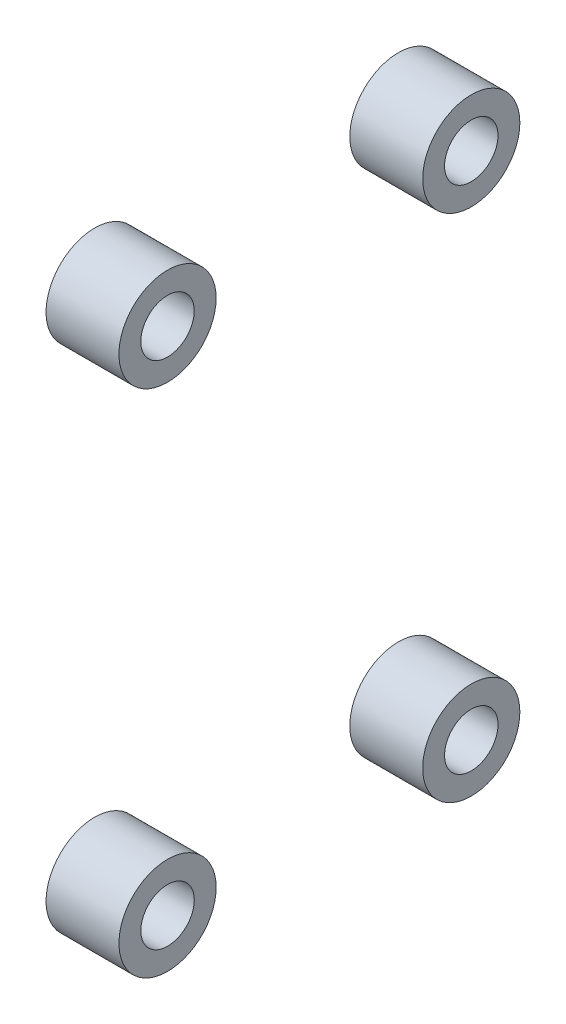
ISO-10303-21;
HEADER;
FILE_DESCRIPTION(('STEP AP214'),'2;1');
FILE_NAME('part.step','',(''),(''),'','','');
FILE_SCHEMA(('AUTOMOTIVE_DESIGN { 1 0 10303 214 1 1 1 1 }'));
ENDSEC;
DATA;
#1=APPLICATION_CONTEXT('core data for automotive mechanical design processes');
#2=APPLICATION_PROTOCOL_DEFINITION('international standard','automotive_design',2000,#1);
#3=PRODUCT_CONTEXT('',#1,'mechanical');
#4=PRODUCT('Part','Part','',(#3));
#5=PRODUCT_RELATED_PRODUCT_CATEGORY('part','',(#4));
#6=PRODUCT_DEFINITION_FORMATION('','',#4);
#7=PRODUCT_DEFINITION_CONTEXT('part definition',#1,'design');
#8=PRODUCT_DEFINITION('design','',#6,#7);
#9=PRODUCT_DEFINITION_SHAPE('','',#8);
#10=(LENGTH_UNIT() NAMED_UNIT(*) SI_UNIT(.MILLI.,.METRE.));
#11=(NAMED_UNIT(*) PLANE_ANGLE_UNIT() SI_UNIT($,.RADIAN.));
#12=(NAMED_UNIT(*) SI_UNIT($,.STERADIAN.) SOLID_ANGLE_UNIT());
#13=UNCERTAINTY_MEASURE_WITH_UNIT(LENGTH_MEASURE(1.E-05),#10,'distance_accuracy_value','');
#14=(GEOMETRIC_REPRESENTATION_CONTEXT(3) GLOBAL_UNCERTAINTY_ASSIGNED_CONTEXT((#13)) GLOBAL_UNIT_ASSIGNED_CONTEXT((#10,
#11,#12)) REPRESENTATION_CONTEXT('',''));
#15=CARTESIAN_POINT('',(0.,0.,0.));
#16=DIRECTION('',(0.,0.,1.));
#17=DIRECTION('',(1.,0.,0.));
#18=AXIS2_PLACEMENT_3D('',#15,#16,#17);
#19=CARTESIAN_POINT('',(-12.9,10.5,84.5));
#20=DIRECTION('',(-1.,0.,0.));
#21=DIRECTION('',(0.,0.,1.));
#22=AXIS2_PLACEMENT_3D('',#19,#20,#21);
#23=CYLINDRICAL_SURFACE('',#22,2.);
#24=CARTESIAN_POINT('',(-12.9,10.5,84.5));
#25=DIRECTION('',(1.,0.,0.));
#26=DIRECTION('',(0.,0.,-1.));
#27=AXIS2_PLACEMENT_3D('',#24,#25,#26);
#28=CIRCLE('',#27,2.);
#29=CARTESIAN_POINT('',(-12.9,10.5,82.5));
#30=VERTEX_POINT('',#29);
#31=EDGE_CURVE('E56',#30,#30,#28,.T.);
#32=ORIENTED_EDGE('',*,*,#31,.F.);
#33=EDGE_LOOP('',(#32));
#34=FACE_BOUND('',#33,.T.);
#35=CARTESIAN_POINT('',(-15.9,10.5,84.5));
#36=DIRECTION('',(1.,0.,0.));
#37=DIRECTION('',(0.,0.,-1.));
#38=AXIS2_PLACEMENT_3D('',#35,#36,#37);
#39=CIRCLE('',#38,2.);
#40=CARTESIAN_POINT('',(-15.9,10.5,82.5));
#41=VERTEX_POINT('',#40);
#42=EDGE_CURVE('E11',#41,#41,#39,.T.);
#43=ORIENTED_EDGE('',*,*,#42,.T.);
#44=EDGE_LOOP('',(#43));
#45=FACE_BOUND('',#44,.T.);
#46=ADVANCED_FACE('F48',(#34,#45),#23,.T.);
#47=CARTESIAN_POINT('',(-12.9,10.5,84.5));
#48=DIRECTION('',(1.,0.,0.));
#49=DIRECTION('',(0.,0.,-1.));
#50=AXIS2_PLACEMENT_3D('',#47,#48,#49);
#51=PLANE('',#50);
#52=CARTESIAN_POINT('',(-12.9,10.5,84.5));
#53=DIRECTION('',(1.,0.,0.));
#54=DIRECTION('',(0.,0.,-1.));
#55=AXIS2_PLACEMENT_3D('',#52,#53,#54);
#56=CIRCLE('',#55,1.1);
#57=CARTESIAN_POINT('',(-12.9,10.5,83.4));
#58=VERTEX_POINT('',#57);
#59=EDGE_CURVE('E61',#58,#58,#56,.F.);
#60=ORIENTED_EDGE('',*,*,#59,.T.);
#61=EDGE_LOOP('',(#60));
#62=FACE_BOUND('',#61,.T.);
#63=ORIENTED_EDGE('',*,*,#31,.T.);
#64=EDGE_LOOP('',(#63));
#65=FACE_BOUND('',#64,.T.);
#66=ADVANCED_FACE('F50',(#62,#65),#51,.T.);
#67=CARTESIAN_POINT('',(-15.9,10.5,84.5));
#68=DIRECTION('',(1.,0.,0.));
#69=DIRECTION('',(0.,0.,-1.));
#70=AXIS2_PLACEMENT_3D('',#67,#68,#69);
#71=PLANE('',#70);
#72=CARTESIAN_POINT('',(-15.9,10.5,84.5));
#73=DIRECTION('',(1.,0.,0.));
#74=DIRECTION('',(0.,0.,-1.));
#75=AXIS2_PLACEMENT_3D('',#72,#73,#74);
#76=CIRCLE('',#75,1.1);
#77=CARTESIAN_POINT('',(-15.9,10.5,83.4));
#78=VERTEX_POINT('',#77);
#79=EDGE_CURVE('E52',#78,#78,#76,.F.);
#80=ORIENTED_EDGE('',*,*,#79,.F.);
#81=EDGE_LOOP('',(#80));
#82=FACE_BOUND('',#81,.T.);
#83=ORIENTED_EDGE('',*,*,#42,.F.);
#84=EDGE_LOOP('',(#83));
#85=FACE_BOUND('',#84,.T.);
#86=ADVANCED_FACE('F71',(#82,#85),#71,.F.);
#87=CARTESIAN_POINT('',(-11.9,10.5,84.5));
#88=DIRECTION('',(-1.,0.,0.));
#89=DIRECTION('',(0.,0.,1.));
#90=AXIS2_PLACEMENT_3D('',#87,#88,#89);
#91=CYLINDRICAL_SURFACE('',#90,1.1);
#92=ORIENTED_EDGE('',*,*,#59,.F.);
#93=EDGE_LOOP('',(#92));
#94=FACE_BOUND('',#93,.T.);
#95=ORIENTED_EDGE('',*,*,#79,.T.);
#96=EDGE_LOOP('',(#95));
#97=FACE_BOUND('',#96,.T.);
#98=ADVANCED_FACE('F69',(#94,#97),#91,.F.);
#99=CLOSED_SHELL('',(#46,#66,#86,#98));
#100=MANIFOLD_SOLID_BREP('B2',#99);
#101=CARTESIAN_POINT('',(-12.9,10.5,97.));
#102=DIRECTION('',(-1.,0.,0.));
#103=DIRECTION('',(0.,0.,1.));
#104=AXIS2_PLACEMENT_3D('',#101,#102,#103);
#105=CYLINDRICAL_SURFACE('',#104,2.);
#106=CARTESIAN_POINT('',(-12.9,10.5,97.));
#107=DIRECTION('',(1.,0.,0.));
#108=DIRECTION('',(0.,0.,-1.));
#109=AXIS2_PLACEMENT_3D('',#106,#107,#108);
#110=CIRCLE('',#109,2.);
#111=CARTESIAN_POINT('',(-12.9,10.5,95.));
#112=VERTEX_POINT('',#111);
#113=EDGE_CURVE('E126',#112,#112,#110,.T.);
#114=ORIENTED_EDGE('',*,*,#113,.F.);
#115=EDGE_LOOP('',(#114));
#116=FACE_BOUND('',#115,.T.);
#117=CARTESIAN_POINT('',(-15.9,10.5,97.));
#118=DIRECTION('',(1.,0.,0.));
#119=DIRECTION('',(0.,0.,-1.));
#120=AXIS2_PLACEMENT_3D('',#117,#118,#119);
#121=CIRCLE('',#120,2.);
#122=CARTESIAN_POINT('',(-15.9,10.5,95.));
#123=VERTEX_POINT('',#122);
#124=EDGE_CURVE('E47',#123,#123,#121,.T.);
#125=ORIENTED_EDGE('',*,*,#124,.T.);
#126=EDGE_LOOP('',(#125));
#127=FACE_BOUND('',#126,.T.);
#128=ADVANCED_FACE('F118',(#116,#127),#105,.T.);
#129=CARTESIAN_POINT('',(-12.9,10.5,97.));
#130=DIRECTION('',(1.,0.,0.));
#131=DIRECTION('',(0.,0.,-1.));
#132=AXIS2_PLACEMENT_3D('',#129,#130,#131);
#133=PLANE('',#132);
#134=CARTESIAN_POINT('',(-12.9,10.5,97.));
#135=DIRECTION('',(1.,0.,0.));
#136=DIRECTION('',(0.,0.,-1.));
#137=AXIS2_PLACEMENT_3D('',#134,#135,#136);
#138=CIRCLE('',#137,1.1);
#139=CARTESIAN_POINT('',(-12.9,10.5,95.9));
#140=VERTEX_POINT('',#139);
#141=EDGE_CURVE('E131',#140,#140,#138,.F.);
#142=ORIENTED_EDGE('',*,*,#141,.T.);
#143=EDGE_LOOP('',(#142));
#144=FACE_BOUND('',#143,.T.);
#145=ORIENTED_EDGE('',*,*,#113,.T.);
#146=EDGE_LOOP('',(#145));
#147=FACE_BOUND('',#146,.T.);
#148=ADVANCED_FACE('F120',(#144,#147),#133,.T.);
#149=CARTESIAN_POINT('',(-15.9,10.5,97.));
#150=DIRECTION('',(1.,0.,0.));
#151=DIRECTION('',(0.,0.,-1.));
#152=AXIS2_PLACEMENT_3D('',#149,#150,#151);
#153=PLANE('',#152);
#154=CARTESIAN_POINT('',(-15.9,10.5,97.));
#155=DIRECTION('',(1.,0.,0.));
#156=DIRECTION('',(0.,0.,-1.));
#157=AXIS2_PLACEMENT_3D('',#154,#155,#156);
#158=CIRCLE('',#157,1.1);
#159=CARTESIAN_POINT('',(-15.9,10.5,95.9));
#160=VERTEX_POINT('',#159);
#161=EDGE_CURVE('E122',#160,#160,#158,.F.);
#162=ORIENTED_EDGE('',*,*,#161,.F.);
#163=EDGE_LOOP('',(#162));
#164=FACE_BOUND('',#163,.T.);
#165=ORIENTED_EDGE('',*,*,#124,.F.);
#166=EDGE_LOOP('',(#165));
#167=FACE_BOUND('',#166,.T.);
#168=ADVANCED_FACE('F141',(#164,#167),#153,.F.);
#169=CARTESIAN_POINT('',(-11.9,10.5,97.));
#170=DIRECTION('',(-1.,0.,0.));
#171=DIRECTION('',(0.,0.,1.));
#172=AXIS2_PLACEMENT_3D('',#169,#170,#171);
#173=CYLINDRICAL_SURFACE('',#172,1.1);
#174=ORIENTED_EDGE('',*,*,#141,.F.);
#175=EDGE_LOOP('',(#174));
#176=FACE_BOUND('',#175,.T.);
#177=ORIENTED_EDGE('',*,*,#161,.T.);
#178=EDGE_LOOP('',(#177));
#179=FACE_BOUND('',#178,.T.);
#180=ADVANCED_FACE('F139',(#176,#179),#173,.F.);
#181=CLOSED_SHELL('',(#128,#148,#168,#180));
#182=MANIFOLD_SOLID_BREP('B6',#181);
#183=CARTESIAN_POINT('',(-12.9,-10.5,84.5));
#184=DIRECTION('',(-1.,0.,0.));
#185=DIRECTION('',(0.,0.,1.));
#186=AXIS2_PLACEMENT_3D('',#183,#184,#185);
#187=CYLINDRICAL_SURFACE('',#186,2.);
#188=CARTESIAN_POINT('',(-12.9,-10.5,84.5));
#189=DIRECTION('',(1.,0.,0.));
#190=DIRECTION('',(0.,0.,-1.));
#191=AXIS2_PLACEMENT_3D('',#188,#189,#190);
#192=CIRCLE('',#191,2.);
#193=CARTESIAN_POINT('',(-12.9,-10.5,82.5));
#194=VERTEX_POINT('',#193);
#195=EDGE_CURVE('E195',#194,#194,#192,.T.);
#196=ORIENTED_EDGE('',*,*,#195,.F.);
#197=EDGE_LOOP('',(#196));
#198=FACE_BOUND('',#197,.T.);
#199=CARTESIAN_POINT('',(-15.9,-10.5,84.5));
#200=DIRECTION('',(1.,0.,0.));
#201=DIRECTION('',(0.,0.,-1.));
#202=AXIS2_PLACEMENT_3D('',#199,#200,#201);
#203=CIRCLE('',#202,2.);
#204=CARTESIAN_POINT('',(-15.9,-10.5,82.5));
#205=VERTEX_POINT('',#204);
#206=EDGE_CURVE('E117',#205,#205,#203,.T.);
#207=ORIENTED_EDGE('',*,*,#206,.T.);
#208=EDGE_LOOP('',(#207));
#209=FACE_BOUND('',#208,.T.);
#210=ADVANCED_FACE('F187',(#198,#209),#187,.T.);
#211=CARTESIAN_POINT('',(-12.9,-10.5,84.5));
#212=DIRECTION('',(1.,0.,0.));
#213=DIRECTION('',(0.,0.,-1.));
#214=AXIS2_PLACEMENT_3D('',#211,#212,#213);
#215=PLANE('',#214);
#216=CARTESIAN_POINT('',(-12.9,-10.5,84.5));
#217=DIRECTION('',(1.,0.,0.));
#218=DIRECTION('',(0.,0.,-1.));
#219=AXIS2_PLACEMENT_3D('',#216,#217,#218);
#220=CIRCLE('',#219,1.1);
#221=CARTESIAN_POINT('',(-12.9,-10.5,83.4));
#222=VERTEX_POINT('',#221);
#223=EDGE_CURVE('E200',#222,#222,#220,.F.);
#224=ORIENTED_EDGE('',*,*,#223,.T.);
#225=EDGE_LOOP('',(#224));
#226=FACE_BOUND('',#225,.T.);
#227=ORIENTED_EDGE('',*,*,#195,.T.);
#228=EDGE_LOOP('',(#227));
#229=FACE_BOUND('',#228,.T.);
#230=ADVANCED_FACE('F189',(#226,#229),#215,.T.);
#231=CARTESIAN_POINT('',(-15.9,-10.5,84.5));
#232=DIRECTION('',(1.,0.,0.));
#233=DIRECTION('',(0.,0.,-1.));
#234=AXIS2_PLACEMENT_3D('',#231,#232,#233);
#235=PLANE('',#234);
#236=CARTESIAN_POINT('',(-15.9,-10.5,84.5));
#237=DIRECTION('',(1.,0.,0.));
#238=DIRECTION('',(0.,0.,-1.));
#239=AXIS2_PLACEMENT_3D('',#236,#237,#238);
#240=CIRCLE('',#239,1.1);
#241=CARTESIAN_POINT('',(-15.9,-10.5,83.4));
#242=VERTEX_POINT('',#241);
#243=EDGE_CURVE('E191',#242,#242,#240,.F.);
#244=ORIENTED_EDGE('',*,*,#243,.F.);
#245=EDGE_LOOP('',(#244));
#246=FACE_BOUND('',#245,.T.);
#247=ORIENTED_EDGE('',*,*,#206,.F.);
#248=EDGE_LOOP('',(#247));
#249=FACE_BOUND('',#248,.T.);
#250=ADVANCED_FACE('F210',(#246,#249),#235,.F.);
#251=CARTESIAN_POINT('',(-11.9,-10.5,84.5));
#252=DIRECTION('',(-1.,0.,0.));
#253=DIRECTION('',(0.,0.,1.));
#254=AXIS2_PLACEMENT_3D('',#251,#252,#253);
#255=CYLINDRICAL_SURFACE('',#254,1.1);
#256=ORIENTED_EDGE('',*,*,#223,.F.);
#257=EDGE_LOOP('',(#256));
#258=FACE_BOUND('',#257,.T.);
#259=ORIENTED_EDGE('',*,*,#243,.T.);
#260=EDGE_LOOP('',(#259));
#261=FACE_BOUND('',#260,.T.);
#262=ADVANCED_FACE('F208',(#258,#261),#255,.F.);
#263=CLOSED_SHELL('',(#210,#230,#250,#262));
#264=MANIFOLD_SOLID_BREP('B42',#263);
#265=CARTESIAN_POINT('',(-12.9,-10.5,97.));
#266=DIRECTION('',(-1.,0.,0.));
#267=DIRECTION('',(0.,0.,1.));
#268=AXIS2_PLACEMENT_3D('',#265,#266,#267);
#269=CYLINDRICAL_SURFACE('',#268,2.);
#270=CARTESIAN_POINT('',(-12.9,-10.5,97.));
#271=DIRECTION('',(1.,0.,0.));
#272=DIRECTION('',(0.,0.,-1.));
#273=AXIS2_PLACEMENT_3D('',#270,#271,#272);
#274=CIRCLE('',#273,2.);
#275=CARTESIAN_POINT('',(-12.9,-10.5,95.));
#276=VERTEX_POINT('',#275);
#277=EDGE_CURVE('E186',#276,#276,#274,.T.);
#278=ORIENTED_EDGE('',*,*,#277,.F.);
#279=EDGE_LOOP('',(#278));
#280=FACE_BOUND('',#279,.T.);
#281=CARTESIAN_POINT('',(-15.9,-10.5,97.));
#282=DIRECTION('',(1.,0.,0.));
#283=DIRECTION('',(0.,0.,-1.));
#284=AXIS2_PLACEMENT_3D('',#281,#282,#283);
#285=CIRCLE('',#284,2.);
#286=CARTESIAN_POINT('',(-15.9,-10.5,95.));
#287=VERTEX_POINT('',#286);
#288=EDGE_CURVE('E256',#287,#287,#285,.T.);
#289=ORIENTED_EDGE('',*,*,#288,.T.);
#290=EDGE_LOOP('',(#289));
#291=FACE_BOUND('',#290,.T.);
#292=ADVANCED_FACE('F249',(#280,#291),#269,.T.);
#293=CARTESIAN_POINT('',(-12.9,-10.5,97.));
#294=DIRECTION('',(1.,0.,0.));
#295=DIRECTION('',(0.,0.,-1.));
#296=AXIS2_PLACEMENT_3D('',#293,#294,#295);
#297=PLANE('',#296);
#298=CARTESIAN_POINT('',(-12.9,-10.5,97.));
#299=DIRECTION('',(1.,0.,0.));
#300=DIRECTION('',(0.,0.,-1.));
#301=AXIS2_PLACEMENT_3D('',#298,#299,#300);
#302=CIRCLE('',#301,1.1);
#303=CARTESIAN_POINT('',(-12.9,-10.5,95.9));
#304=VERTEX_POINT('',#303);
#305=EDGE_CURVE('E261',#304,#304,#302,.F.);
#306=ORIENTED_EDGE('',*,*,#305,.T.);
#307=EDGE_LOOP('',(#306));
#308=FACE_BOUND('',#307,.T.);
#309=ORIENTED_EDGE('',*,*,#277,.T.);
#310=EDGE_LOOP('',(#309));
#311=FACE_BOUND('',#310,.T.);
#312=ADVANCED_FACE('F274',(#308,#311),#297,.T.);
#313=CARTESIAN_POINT('',(-15.9,-10.5,97.));
#314=DIRECTION('',(1.,0.,0.));
#315=DIRECTION('',(0.,0.,-1.));
#316=AXIS2_PLACEMENT_3D('',#313,#314,#315);
#317=PLANE('',#316);
#318=CARTESIAN_POINT('',(-15.9,-10.5,97.));
#319=DIRECTION('',(1.,0.,0.));
#320=DIRECTION('',(0.,0.,-1.));
#321=AXIS2_PLACEMENT_3D('',#318,#319,#320);
#322=CIRCLE('',#321,1.1);
#323=CARTESIAN_POINT('',(-15.9,-10.5,95.9));
#324=VERTEX_POINT('',#323);
#325=EDGE_CURVE('E252',#324,#324,#322,.F.);
#326=ORIENTED_EDGE('',*,*,#325,.F.);
#327=EDGE_LOOP('',(#326));
#328=FACE_BOUND('',#327,.T.);
#329=ORIENTED_EDGE('',*,*,#288,.F.);
#330=EDGE_LOOP('',(#329));
#331=FACE_BOUND('',#330,.T.);
#332=ADVANCED_FACE('F271',(#328,#331),#317,.F.);
#333=CARTESIAN_POINT('',(-11.9,-10.5,97.));
#334=DIRECTION('',(-1.,0.,0.));
#335=DIRECTION('',(0.,0.,1.));
#336=AXIS2_PLACEMENT_3D('',#333,#334,#335);
#337=CYLINDRICAL_SURFACE('',#336,1.1);
#338=ORIENTED_EDGE('',*,*,#305,.F.);
#339=EDGE_LOOP('',(#338));
#340=FACE_BOUND('',#339,.T.);
#341=ORIENTED_EDGE('',*,*,#325,.T.);
#342=EDGE_LOOP('',(#341));
#343=FACE_BOUND('',#342,.T.);
#344=ADVANCED_FACE('F269',(#340,#343),#337,.F.);
#345=CLOSED_SHELL('',(#292,#312,#332,#344));
#346=MANIFOLD_SOLID_BREP('B112',#345);
#347=ADVANCED_BREP_SHAPE_REPRESENTATION('',(#18,#100,#182,#264,#346),#14);
#348=SHAPE_DEFINITION_REPRESENTATION(#9,#347);
ENDSEC;
END-ISO-10303-21;
